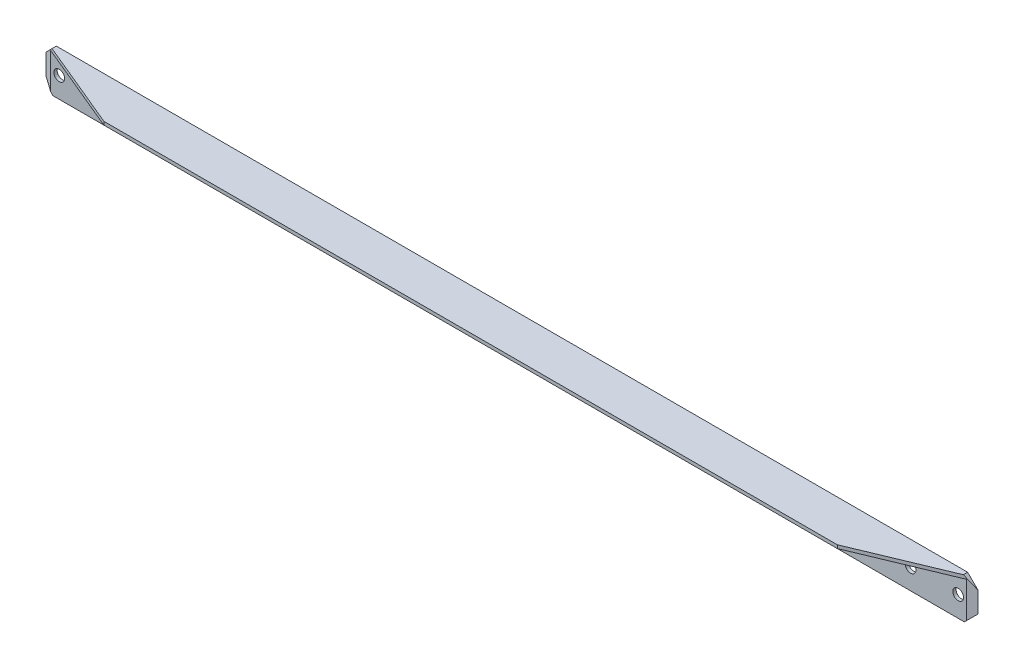
ISO-10303-21;
HEADER;
FILE_DESCRIPTION(('STEP AP214'),'2;1');
FILE_NAME('part.step','',(''),(''),'','','');
FILE_SCHEMA(('AUTOMOTIVE_DESIGN { 1 0 10303 214 1 1 1 1 }'));
ENDSEC;
DATA;
#1=APPLICATION_CONTEXT('core data for automotive mechanical design processes');
#2=APPLICATION_PROTOCOL_DEFINITION('international standard','automotive_design',2000,#1);
#3=PRODUCT_CONTEXT('',#1,'mechanical');
#4=PRODUCT('Part','Part','',(#3));
#5=PRODUCT_RELATED_PRODUCT_CATEGORY('part','',(#4));
#6=PRODUCT_DEFINITION_FORMATION('','',#4);
#7=PRODUCT_DEFINITION_CONTEXT('part definition',#1,'design');
#8=PRODUCT_DEFINITION('design','',#6,#7);
#9=PRODUCT_DEFINITION_SHAPE('','',#8);
#10=(LENGTH_UNIT() NAMED_UNIT(*) SI_UNIT(.MILLI.,.METRE.));
#11=(NAMED_UNIT(*) PLANE_ANGLE_UNIT() SI_UNIT($,.RADIAN.));
#12=(NAMED_UNIT(*) SI_UNIT($,.STERADIAN.) SOLID_ANGLE_UNIT());
#13=UNCERTAINTY_MEASURE_WITH_UNIT(LENGTH_MEASURE(1.E-05),#10,'distance_accuracy_value','');
#14=(GEOMETRIC_REPRESENTATION_CONTEXT(3) GLOBAL_UNCERTAINTY_ASSIGNED_CONTEXT((#13)) GLOBAL_UNIT_ASSIGNED_CONTEXT((#10,
#11,#12)) REPRESENTATION_CONTEXT('',''));
#15=CARTESIAN_POINT('',(0.,0.,0.));
#16=DIRECTION('',(0.,0.,1.));
#17=DIRECTION('',(1.,0.,0.));
#18=AXIS2_PLACEMENT_3D('',#15,#16,#17);
#19=CARTESIAN_POINT('',(-1126.,99.9999999999921,8.));
#20=DIRECTION('',(0.,0.,1.));
#21=DIRECTION('',(1.,0.,0.));
#22=AXIS2_PLACEMENT_3D('',#19,#20,#21);
#23=PLANE('',#22);
#24=CARTESIAN_POINT('',(-1086.,49.9999999999924,8.));
#25=DIRECTION('',(0.,0.,1.));
#26=DIRECTION('',(-1.,0.,0.));
#27=AXIS2_PLACEMENT_3D('',#24,#25,#26);
#28=CIRCLE('',#27,12.9999999999998);
#29=CARTESIAN_POINT('',(-1099.,49.9999999999924,8.));
#30=VERTEX_POINT('',#29);
#31=EDGE_CURVE('E139',#30,#30,#28,.T.);
#32=ORIENTED_EDGE('',*,*,#31,.F.);
#33=EDGE_LOOP('',(#32));
#34=FACE_BOUND('',#33,.T.);
#35=CARTESIAN_POINT('',(-160.,49.9999999999988,8.));
#36=DIRECTION('',(0.,0.,1.));
#37=DIRECTION('',(-1.,0.,0.));
#38=AXIS2_PLACEMENT_3D('',#35,#36,#37);
#39=CIRCLE('',#38,13.);
#40=CARTESIAN_POINT('',(-173.,49.9999999999988,8.));
#41=VERTEX_POINT('',#40);
#42=EDGE_CURVE('E154',#41,#41,#39,.T.);
#43=ORIENTED_EDGE('',*,*,#42,.F.);
#44=EDGE_LOOP('',(#43));
#45=FACE_BOUND('',#44,.T.);
#46=CARTESIAN_POINT('',(160.,49.9999999999999,8.));
#47=DIRECTION('',(0.,0.,1.));
#48=DIRECTION('',(1.,0.,0.));
#49=AXIS2_PLACEMENT_3D('',#46,#47,#48);
#50=CIRCLE('',#49,13.);
#51=CARTESIAN_POINT('',(173.,49.9999999999999,8.));
#52=VERTEX_POINT('',#51);
#53=EDGE_CURVE('E166',#52,#52,#50,.T.);
#54=ORIENTED_EDGE('',*,*,#53,.F.);
#55=EDGE_LOOP('',(#54));
#56=FACE_BOUND('',#55,.T.);
#57=CARTESIAN_POINT('',(0.,49.9999999999998,8.));
#58=DIRECTION('',(0.,0.,1.));
#59=DIRECTION('',(1.,0.,0.));
#60=AXIS2_PLACEMENT_3D('',#57,#58,#59);
#61=CIRCLE('',#60,13.);
#62=CARTESIAN_POINT('',(13.0000000000001,49.9999999999998,8.));
#63=VERTEX_POINT('',#62);
#64=EDGE_CURVE('E178',#63,#63,#61,.T.);
#65=ORIENTED_EDGE('',*,*,#64,.F.);
#66=EDGE_LOOP('',(#65));
#67=FACE_BOUND('',#66,.T.);
#68=CARTESIAN_POINT('',(1086.,50.,8.));
#69=DIRECTION('',(0.,0.,1.));
#70=DIRECTION('',(1.,0.,0.));
#71=AXIS2_PLACEMENT_3D('',#68,#69,#70);
#72=CIRCLE('',#71,12.9999999999998);
#73=CARTESIAN_POINT('',(1099.,50.,8.));
#74=VERTEX_POINT('',#73);
#75=EDGE_CURVE('E190',#74,#74,#72,.T.);
#76=ORIENTED_EDGE('',*,*,#75,.F.);
#77=EDGE_LOOP('',(#76));
#78=FACE_BOUND('',#77,.T.);
#79=CARTESIAN_POINT('',(971.,50.,8.));
#80=DIRECTION('',(0.,0.,1.));
#81=DIRECTION('',(1.,0.,0.));
#82=AXIS2_PLACEMENT_3D('',#79,#80,#81);
#83=CIRCLE('',#82,13.);
#84=CARTESIAN_POINT('',(984.,50.,8.));
#85=VERTEX_POINT('',#84);
#86=EDGE_CURVE('E184',#85,#85,#83,.T.);
#87=ORIENTED_EDGE('',*,*,#86,.F.);
#88=EDGE_LOOP('',(#87));
#89=FACE_BOUND('',#88,.T.);
#90=CARTESIAN_POINT('',(80.0000000000002,49.9999999999999,8.));
#91=DIRECTION('',(0.,0.,1.));
#92=DIRECTION('',(1.,0.,0.));
#93=AXIS2_PLACEMENT_3D('',#90,#91,#92);
#94=CIRCLE('',#93,13.);
#95=CARTESIAN_POINT('',(93.0000000000002,49.9999999999999,8.));
#96=VERTEX_POINT('',#95);
#97=EDGE_CURVE('E172',#96,#96,#94,.T.);
#98=ORIENTED_EDGE('',*,*,#97,.F.);
#99=EDGE_LOOP('',(#98));
#100=FACE_BOUND('',#99,.T.);
#101=CARTESIAN_POINT('',(-79.9999999999999,49.9999999999994,8.));
#102=DIRECTION('',(0.,0.,1.));
#103=DIRECTION('',(-1.,0.,0.));
#104=AXIS2_PLACEMENT_3D('',#101,#102,#103);
#105=CIRCLE('',#104,13.);
#106=CARTESIAN_POINT('',(-92.9999999999999,49.9999999999994,8.));
#107=VERTEX_POINT('',#106);
#108=EDGE_CURVE('E160',#107,#107,#105,.T.);
#109=ORIENTED_EDGE('',*,*,#108,.F.);
#110=EDGE_LOOP('',(#109));
#111=FACE_BOUND('',#110,.T.);
#112=CARTESIAN_POINT('',(-970.999999999999,49.9999999999932,8.));
#113=DIRECTION('',(0.,0.,1.));
#114=DIRECTION('',(-1.,0.,0.));
#115=AXIS2_PLACEMENT_3D('',#112,#113,#114);
#116=CIRCLE('',#115,13.0000000000002);
#117=CARTESIAN_POINT('',(-984.,49.9999999999932,8.));
#118=VERTEX_POINT('',#117);
#119=EDGE_CURVE('E148',#118,#118,#116,.T.);
#120=ORIENTED_EDGE('',*,*,#119,.F.);
#121=EDGE_LOOP('',(#120));
#122=FACE_BOUND('',#121,.T.);
#123=DIRECTION('',(1.,0.,0.));
#124=VECTOR('',#123,1.);
#125=CARTESIAN_POINT('',(-1126.,91.9999999999921,8.));
#126=LINE('',#125,#124);
#127=CARTESIAN_POINT('',(-1106.8,91.9999999999921,8.));
#128=VERTEX_POINT('',#127);
#129=CARTESIAN_POINT('',(1106.8,91.9999999999921,8.));
#130=VERTEX_POINT('',#129);
#131=EDGE_CURVE('E40',#128,#130,#126,.T.);
#132=ORIENTED_EDGE('',*,*,#131,.F.);
#133=DIRECTION('',(0.,-1.,0.));
#134=VECTOR('',#133,1.);
#135=CARTESIAN_POINT('',(-1106.8,99.9999999999921,8.));
#136=LINE('',#135,#134);
#137=CARTESIAN_POINT('',(-1106.8,5.79999999999307,8.));
#138=VERTEX_POINT('',#137);
#139=EDGE_CURVE('E235',#128,#138,#136,.T.);
#140=ORIENTED_EDGE('',*,*,#139,.T.);
#141=DIRECTION('',(-0.707106781186551,0.707106781186544,0.));
#142=VECTOR('',#141,1.);
#143=CARTESIAN_POINT('',(-1163.5,62.499999999992,8.));
#144=LINE('',#143,#142);
#145=CARTESIAN_POINT('',(-1101.,-7.78694259261069E-12,8.));
#146=VERTEX_POINT('',#145);
#147=EDGE_CURVE('E227',#138,#146,#144,.F.);
#148=ORIENTED_EDGE('',*,*,#147,.T.);
#149=DIRECTION('',(1.,0.,0.));
#150=VECTOR('',#149,1.);
#151=CARTESIAN_POINT('',(-1126.,-7.85482789922298E-12,8.));
#152=LINE('',#151,#150);
#153=CARTESIAN_POINT('',(1101.,-1.54621480411135E-13,8.));
#154=VERTEX_POINT('',#153);
#155=EDGE_CURVE('E196',#146,#154,#152,.T.);
#156=ORIENTED_EDGE('',*,*,#155,.T.);
#157=DIRECTION('',(-0.707106781186548,-0.707106781186548,0.));
#158=VECTOR('',#157,1.);
#159=CARTESIAN_POINT('',(37.4999999999959,-1063.5,8.));
#160=LINE('',#159,#158);
#161=CARTESIAN_POINT('',(1106.8,5.80000000000029,8.));
#162=VERTEX_POINT('',#161);
#163=EDGE_CURVE('E211',#154,#162,#160,.F.);
#164=ORIENTED_EDGE('',*,*,#163,.T.);
#165=DIRECTION('',(0.,-1.,0.));
#166=VECTOR('',#165,1.);
#167=CARTESIAN_POINT('',(1106.8,99.9999999999999,8.));
#168=LINE('',#167,#166);
#169=EDGE_CURVE('E254',#130,#162,#168,.T.);
#170=ORIENTED_EDGE('',*,*,#169,.F.);
#171=EDGE_LOOP('',(#132,#140,#148,#156,#164,#170));
#172=FACE_BOUND('',#171,.T.);
#173=ADVANCED_FACE('F36',(#34,#45,#56,#67,#78,#89,#100,#111,#122,#172),#23,.T.);
#174=CARTESIAN_POINT('',(1126.,100.,8.));
#175=DIRECTION('',(0.,-1.,0.));
#176=DIRECTION('',(1.,0.,0.));
#177=AXIS2_PLACEMENT_3D('',#174,#175,#176);
#178=PLANE('',#177);
#179=DIRECTION('',(0.923076923076923,0.,0.384615384615384));
#180=VECTOR('',#179,1.);
#181=CARTESIAN_POINT('',(-886.,99.9999999999992,100.));
#182=LINE('',#181,#180);
#183=CARTESIAN_POINT('',(-1101.,99.9999999999922,10.4166666666699));
#184=VERTEX_POINT('',#183);
#185=CARTESIAN_POINT('',(-886.,99.9999999999992,100.));
#186=VERTEX_POINT('',#185);
#187=EDGE_CURVE('E53',#184,#186,#182,.T.);
#188=ORIENTED_EDGE('',*,*,#187,.T.);
#189=DIRECTION('',(-1.,0.,0.));
#190=VECTOR('',#189,1.);
#191=CARTESIAN_POINT('',(-1126.,99.9999999999921,100.));
#192=LINE('',#191,#190);
#193=CARTESIAN_POINT('',(886.,99.9999999999992,100.));
#194=VERTEX_POINT('',#193);
#195=EDGE_CURVE('E128',#194,#186,#192,.T.);
#196=ORIENTED_EDGE('',*,*,#195,.F.);
#197=DIRECTION('',(-0.923076923076923,0.,0.384615384615384));
#198=VECTOR('',#197,1.);
#199=CARTESIAN_POINT('',(886.,99.9999999999992,100.));
#200=LINE('',#199,#198);
#201=CARTESIAN_POINT('',(1101.,99.9999999999999,10.4166666666666));
#202=VERTEX_POINT('',#201);
#203=EDGE_CURVE('E263',#202,#194,#200,.T.);
#204=ORIENTED_EDGE('',*,*,#203,.F.);
#205=DIRECTION('',(0.,0.,-1.));
#206=VECTOR('',#205,1.);
#207=CARTESIAN_POINT('',(1101.,99.9999999999999,8.));
#208=LINE('',#207,#206);
#209=CARTESIAN_POINT('',(1101.,99.9999999999999,0.));
#210=VERTEX_POINT('',#209);
#211=EDGE_CURVE('E214',#202,#210,#208,.T.);
#212=ORIENTED_EDGE('',*,*,#211,.T.);
#213=DIRECTION('',(-1.,0.,0.));
#214=VECTOR('',#213,1.);
#215=CARTESIAN_POINT('',(1126.,100.,0.));
#216=LINE('',#215,#214);
#217=CARTESIAN_POINT('',(-1101.,99.9999999999922,0.));
#218=VERTEX_POINT('',#217);
#219=EDGE_CURVE('E199',#210,#218,#216,.T.);
#220=ORIENTED_EDGE('',*,*,#219,.T.);
#221=DIRECTION('',(0.,0.,1.));
#222=VECTOR('',#221,1.);
#223=CARTESIAN_POINT('',(-1101.,99.9999999999922,8.));
#224=LINE('',#223,#222);
#225=EDGE_CURVE('E46',#218,#184,#224,.T.);
#226=ORIENTED_EDGE('',*,*,#225,.T.);
#227=EDGE_LOOP('',(#188,#196,#204,#212,#220,#226));
#228=FACE_BOUND('',#227,.T.);
#229=ADVANCED_FACE('F126',(#228),#178,.F.);
#230=CARTESIAN_POINT('',(-1126.,91.9999999999921,100.));
#231=DIRECTION('',(0.,1.,0.));
#232=DIRECTION('',(0.,0.,1.));
#233=AXIS2_PLACEMENT_3D('',#230,#231,#232);
#234=PLANE('',#233);
#235=DIRECTION('',(0.923076923076923,0.,0.384615384615384));
#236=VECTOR('',#235,1.);
#237=CARTESIAN_POINT('',(-1090.49704142012,91.9999999999921,14.792899408284));
#238=LINE('',#237,#236);
#239=CARTESIAN_POINT('',(-886.,91.9999999999921,100.));
#240=VERTEX_POINT('',#239);
#241=EDGE_CURVE('E117',#128,#240,#238,.T.);
#242=ORIENTED_EDGE('',*,*,#241,.F.);
#243=ORIENTED_EDGE('',*,*,#131,.T.);
#244=DIRECTION('',(-0.923076923076923,0.,0.384615384615384));
#245=VECTOR('',#244,1.);
#246=CARTESIAN_POINT('',(-828.366863905326,91.9999999999921,814.319526627218));
#247=LINE('',#246,#245);
#248=CARTESIAN_POINT('',(886.,91.9999999999921,100.));
#249=VERTEX_POINT('',#248);
#250=EDGE_CURVE('E257',#130,#249,#247,.T.);
#251=ORIENTED_EDGE('',*,*,#250,.T.);
#252=DIRECTION('',(1.,0.,0.));
#253=VECTOR('',#252,1.);
#254=CARTESIAN_POINT('',(-1126.,91.9999999999921,100.));
#255=LINE('',#254,#253);
#256=EDGE_CURVE('E136',#240,#249,#255,.T.);
#257=ORIENTED_EDGE('',*,*,#256,.F.);
#258=EDGE_LOOP('',(#242,#243,#251,#257));
#259=FACE_BOUND('',#258,.T.);
#260=ADVANCED_FACE('F275',(#259),#234,.F.);
#261=CARTESIAN_POINT('',(-1126.,91.9999999999921,100.));
#262=DIRECTION('',(0.,0.,1.));
#263=DIRECTION('',(1.,0.,0.));
#264=AXIS2_PLACEMENT_3D('',#261,#262,#263);
#265=PLANE('',#264);
#266=ORIENTED_EDGE('',*,*,#195,.T.);
#267=DIRECTION('',(0.,1.,0.));
#268=VECTOR('',#267,1.);
#269=CARTESIAN_POINT('',(-886.,-8.63198401646059E-12,100.));
#270=LINE('',#269,#268);
#271=EDGE_CURVE('E114',#240,#186,#270,.T.);
#272=ORIENTED_EDGE('',*,*,#271,.F.);
#273=ORIENTED_EDGE('',*,*,#256,.T.);
#274=DIRECTION('',(0.,1.,0.));
#275=VECTOR('',#274,1.);
#276=CARTESIAN_POINT('',(886.,-2.50000087020918E-05,100.));
#277=LINE('',#276,#275);
#278=EDGE_CURVE('E134',#249,#194,#277,.T.);
#279=ORIENTED_EDGE('',*,*,#278,.T.);
#280=EDGE_LOOP('',(#266,#272,#273,#279));
#281=FACE_BOUND('',#280,.T.);
#282=ADVANCED_FACE('F132',(#281),#265,.T.);
#283=CARTESIAN_POINT('',(-1101.,-7.76762954332575E-12,8.));
#284=DIRECTION('',(0.707106781186544,0.707106781186551,0.));
#285=DIRECTION('',(-0.707106781186551,0.707106781186544,0.));
#286=AXIS2_PLACEMENT_3D('',#283,#284,#285);
#287=PLANE('',#286);
#288=ORIENTED_EDGE('',*,*,#147,.F.);
#289=DIRECTION('',(0.678280102733068,-0.678280102733062,0.282616709472112));
#290=VECTOR('',#289,1.);
#291=CARTESIAN_POINT('',(-1101.46325878594,0.463258785934797,10.2236421725243));
#292=LINE('',#291,#290);
#293=CARTESIAN_POINT('',(-1126.,24.999999999993,0.));
#294=VERTEX_POINT('',#293);
#295=EDGE_CURVE('E121',#138,#294,#292,.F.);
#296=ORIENTED_EDGE('',*,*,#295,.T.);
#297=DIRECTION('',(0.707106781186551,-0.707106781186544,0.));
#298=VECTOR('',#297,1.);
#299=CARTESIAN_POINT('',(-1101.,-7.76762954332575E-12,0.));
#300=LINE('',#299,#298);
#301=CARTESIAN_POINT('',(-1101.,-7.76762954332575E-12,0.));
#302=VERTEX_POINT('',#301);
#303=EDGE_CURVE('E224',#302,#294,#300,.F.);
#304=ORIENTED_EDGE('',*,*,#303,.F.);
#305=DIRECTION('',(0.,0.,-1.));
#306=VECTOR('',#305,1.);
#307=CARTESIAN_POINT('',(-1101.,-7.76762954332575E-12,8.));
#308=LINE('',#307,#306);
#309=EDGE_CURVE('E221',#146,#302,#308,.T.);
#310=ORIENTED_EDGE('',*,*,#309,.F.);
#311=EDGE_LOOP('',(#288,#296,#304,#310));
#312=FACE_BOUND('',#311,.T.);
#313=ADVANCED_FACE('F244',(#312),#287,.F.);
#314=CARTESIAN_POINT('',(-1126.,74.9999999999919,8.));
#315=DIRECTION('',(0.707106781186556,-0.707106781186539,0.));
#316=DIRECTION('',(0.707106781186539,0.707106781186556,0.));
#317=AXIS2_PLACEMENT_3D('',#314,#315,#316);
#318=PLANE('',#317);
#319=DIRECTION('',(-0.707106781186539,-0.707106781186556,0.));
#320=VECTOR('',#319,1.);
#321=CARTESIAN_POINT('',(-1126.,74.9999999999919,0.));
#322=LINE('',#321,#320);
#323=CARTESIAN_POINT('',(-1126.,74.9999999999915,0.));
#324=VERTEX_POINT('',#323);
#325=EDGE_CURVE('E60',#324,#218,#322,.F.);
#326=ORIENTED_EDGE('',*,*,#325,.F.);
#327=DIRECTION('',(-0.678280102733059,-0.678280102733075,-0.282616709472106));
#328=VECTOR('',#327,1.);
#329=CARTESIAN_POINT('',(-1124.46645367412,76.5335463258705,0.638977635782847));
#330=LINE('',#329,#328);
#331=EDGE_CURVE('E11',#324,#184,#330,.F.);
#332=ORIENTED_EDGE('',*,*,#331,.T.);
#333=ORIENTED_EDGE('',*,*,#225,.F.);
#334=EDGE_LOOP('',(#326,#332,#333));
#335=FACE_BOUND('',#334,.T.);
#336=ADVANCED_FACE('F38',(#335),#318,.F.);
#337=CARTESIAN_POINT('',(-1126.,99.9999999999921,0.));
#338=DIRECTION('',(0.,0.,1.));
#339=DIRECTION('',(1.,0.,0.));
#340=AXIS2_PLACEMENT_3D('',#337,#338,#339);
#341=PLANE('',#340);
#342=CARTESIAN_POINT('',(-970.999999999999,49.9999999999932,0.));
#343=DIRECTION('',(0.,0.,1.));
#344=DIRECTION('',(-1.,0.,0.));
#345=AXIS2_PLACEMENT_3D('',#342,#343,#344);
#346=CIRCLE('',#345,13.0000000000002);
#347=CARTESIAN_POINT('',(-984.,49.9999999999932,0.));
#348=VERTEX_POINT('',#347);
#349=EDGE_CURVE('E146',#348,#348,#346,.T.);
#350=ORIENTED_EDGE('',*,*,#349,.T.);
#351=EDGE_LOOP('',(#350));
#352=FACE_BOUND('',#351,.T.);
#353=CARTESIAN_POINT('',(-79.9999999999999,49.9999999999994,0.));
#354=DIRECTION('',(0.,0.,1.));
#355=DIRECTION('',(-1.,0.,0.));
#356=AXIS2_PLACEMENT_3D('',#353,#354,#355);
#357=CIRCLE('',#356,13.);
#358=CARTESIAN_POINT('',(-92.9999999999999,49.9999999999994,0.));
#359=VERTEX_POINT('',#358);
#360=EDGE_CURVE('E157',#359,#359,#357,.T.);
#361=ORIENTED_EDGE('',*,*,#360,.T.);
#362=EDGE_LOOP('',(#361));
#363=FACE_BOUND('',#362,.T.);
#364=CARTESIAN_POINT('',(80.0000000000002,49.9999999999999,0.));
#365=DIRECTION('',(0.,0.,1.));
#366=DIRECTION('',(1.,0.,0.));
#367=AXIS2_PLACEMENT_3D('',#364,#365,#366);
#368=CIRCLE('',#367,13.);
#369=CARTESIAN_POINT('',(93.0000000000002,49.9999999999999,0.));
#370=VERTEX_POINT('',#369);
#371=EDGE_CURVE('E169',#370,#370,#368,.T.);
#372=ORIENTED_EDGE('',*,*,#371,.T.);
#373=EDGE_LOOP('',(#372));
#374=FACE_BOUND('',#373,.T.);
#375=CARTESIAN_POINT('',(971.,50.,0.));
#376=DIRECTION('',(0.,0.,1.));
#377=DIRECTION('',(1.,0.,0.));
#378=AXIS2_PLACEMENT_3D('',#375,#376,#377);
#379=CIRCLE('',#378,13.);
#380=CARTESIAN_POINT('',(984.,50.,0.));
#381=VERTEX_POINT('',#380);
#382=EDGE_CURVE('E181',#381,#381,#379,.T.);
#383=ORIENTED_EDGE('',*,*,#382,.T.);
#384=EDGE_LOOP('',(#383));
#385=FACE_BOUND('',#384,.T.);
#386=DIRECTION('',(0.,-1.,0.));
#387=VECTOR('',#386,1.);
#388=CARTESIAN_POINT('',(-1126.,-7.85482789922298E-12,0.));
#389=LINE('',#388,#387);
#390=EDGE_CURVE('E193',#324,#294,#389,.T.);
#391=ORIENTED_EDGE('',*,*,#390,.F.);
#392=ORIENTED_EDGE('',*,*,#325,.T.);
#393=ORIENTED_EDGE('',*,*,#219,.F.);
#394=DIRECTION('',(-0.707106781186546,0.707106781186549,0.));
#395=VECTOR('',#394,1.);
#396=CARTESIAN_POINT('',(1101.,99.9999999999999,0.));
#397=LINE('',#396,#395);
#398=CARTESIAN_POINT('',(1126.,74.9999999999999,0.));
#399=VERTEX_POINT('',#398);
#400=EDGE_CURVE('E216',#210,#399,#397,.F.);
#401=ORIENTED_EDGE('',*,*,#400,.T.);
#402=DIRECTION('',(0.,1.,0.));
#403=VECTOR('',#402,1.);
#404=CARTESIAN_POINT('',(1126.,0.,0.));
#405=LINE('',#404,#403);
#406=CARTESIAN_POINT('',(1126.,25.0000000000004,0.));
#407=VERTEX_POINT('',#406);
#408=EDGE_CURVE('E203',#407,#399,#405,.T.);
#409=ORIENTED_EDGE('',*,*,#408,.F.);
#410=DIRECTION('',(0.707106781186548,0.707106781186548,0.));
#411=VECTOR('',#410,1.);
#412=CARTESIAN_POINT('',(1126.,24.9999999999998,0.));
#413=LINE('',#412,#411);
#414=CARTESIAN_POINT('',(1101.,0.,0.));
#415=VERTEX_POINT('',#414);
#416=EDGE_CURVE('E198',#407,#415,#413,.F.);
#417=ORIENTED_EDGE('',*,*,#416,.T.);
#418=DIRECTION('',(1.,0.,0.));
#419=VECTOR('',#418,1.);
#420=CARTESIAN_POINT('',(-1126.,-7.85482789922298E-12,0.));
#421=LINE('',#420,#419);
#422=EDGE_CURVE('E201',#302,#415,#421,.T.);
#423=ORIENTED_EDGE('',*,*,#422,.F.);
#424=ORIENTED_EDGE('',*,*,#303,.T.);
#425=EDGE_LOOP('',(#391,#392,#393,#401,#409,#417,#423,#424));
#426=FACE_BOUND('',#425,.T.);
#427=CARTESIAN_POINT('',(1086.,50.,0.));
#428=DIRECTION('',(0.,0.,1.));
#429=DIRECTION('',(1.,0.,0.));
#430=AXIS2_PLACEMENT_3D('',#427,#428,#429);
#431=CIRCLE('',#430,12.9999999999998);
#432=CARTESIAN_POINT('',(1099.,50.,0.));
#433=VERTEX_POINT('',#432);
#434=EDGE_CURVE('E187',#433,#433,#431,.T.);
#435=ORIENTED_EDGE('',*,*,#434,.T.);
#436=EDGE_LOOP('',(#435));
#437=FACE_BOUND('',#436,.T.);
#438=CARTESIAN_POINT('',(0.,49.9999999999998,0.));
#439=DIRECTION('',(0.,0.,1.));
#440=DIRECTION('',(1.,0.,0.));
#441=AXIS2_PLACEMENT_3D('',#438,#439,#440);
#442=CIRCLE('',#441,13.);
#443=CARTESIAN_POINT('',(13.0000000000001,49.9999999999998,0.));
#444=VERTEX_POINT('',#443);
#445=EDGE_CURVE('E175',#444,#444,#442,.T.);
#446=ORIENTED_EDGE('',*,*,#445,.T.);
#447=EDGE_LOOP('',(#446));
#448=FACE_BOUND('',#447,.T.);
#449=CARTESIAN_POINT('',(160.,49.9999999999999,0.));
#450=DIRECTION('',(0.,0.,1.));
#451=DIRECTION('',(1.,0.,0.));
#452=AXIS2_PLACEMENT_3D('',#449,#450,#451);
#453=CIRCLE('',#452,13.);
#454=CARTESIAN_POINT('',(173.,49.9999999999999,0.));
#455=VERTEX_POINT('',#454);
#456=EDGE_CURVE('E163',#455,#455,#453,.T.);
#457=ORIENTED_EDGE('',*,*,#456,.T.);
#458=EDGE_LOOP('',(#457));
#459=FACE_BOUND('',#458,.T.);
#460=CARTESIAN_POINT('',(-160.,49.9999999999988,0.));
#461=DIRECTION('',(0.,0.,1.));
#462=DIRECTION('',(-1.,0.,0.));
#463=AXIS2_PLACEMENT_3D('',#460,#461,#462);
#464=CIRCLE('',#463,13.);
#465=CARTESIAN_POINT('',(-173.,49.9999999999988,0.));
#466=VERTEX_POINT('',#465);
#467=EDGE_CURVE('E151',#466,#466,#464,.T.);
#468=ORIENTED_EDGE('',*,*,#467,.T.);
#469=EDGE_LOOP('',(#468));
#470=FACE_BOUND('',#469,.T.);
#471=CARTESIAN_POINT('',(-1086.,49.9999999999924,0.));
#472=DIRECTION('',(0.,0.,1.));
#473=DIRECTION('',(-1.,0.,0.));
#474=AXIS2_PLACEMENT_3D('',#471,#472,#473);
#475=CIRCLE('',#474,12.9999999999998);
#476=CARTESIAN_POINT('',(-1099.,49.9999999999924,0.));
#477=VERTEX_POINT('',#476);
#478=EDGE_CURVE('E135',#477,#477,#475,.T.);
#479=ORIENTED_EDGE('',*,*,#478,.T.);
#480=EDGE_LOOP('',(#479));
#481=FACE_BOUND('',#480,.T.);
#482=ADVANCED_FACE('F245',(#352,#363,#374,#385,#426,#437,#448,#459,#470,#481),#341,.F.);
#483=CARTESIAN_POINT('',(-1126.,-7.85482789922298E-12,8.));
#484=DIRECTION('',(0.,1.,0.));
#485=DIRECTION('',(-1.,0.,0.));
#486=AXIS2_PLACEMENT_3D('',#483,#484,#485);
#487=PLANE('',#486);
#488=ORIENTED_EDGE('',*,*,#155,.F.);
#489=ORIENTED_EDGE('',*,*,#309,.T.);
#490=ORIENTED_EDGE('',*,*,#422,.T.);
#491=DIRECTION('',(0.,0.,1.));
#492=VECTOR('',#491,1.);
#493=CARTESIAN_POINT('',(1101.,0.,8.));
#494=LINE('',#493,#492);
#495=EDGE_CURVE('E208',#415,#154,#494,.T.);
#496=ORIENTED_EDGE('',*,*,#495,.T.);
#497=EDGE_LOOP('',(#488,#489,#490,#496));
#498=FACE_BOUND('',#497,.T.);
#499=ADVANCED_FACE('F240',(#498),#487,.F.);
#500=CARTESIAN_POINT('',(1086.,50.,8.));
#501=DIRECTION('',(0.,0.,-1.));
#502=DIRECTION('',(-1.,0.,0.));
#503=AXIS2_PLACEMENT_3D('',#500,#501,#502);
#504=CYLINDRICAL_SURFACE('',#503,12.9999999999998);
#505=ORIENTED_EDGE('',*,*,#75,.T.);
#506=EDGE_LOOP('',(#505));
#507=FACE_BOUND('',#506,.T.);
#508=ORIENTED_EDGE('',*,*,#434,.F.);
#509=EDGE_LOOP('',(#508));
#510=FACE_BOUND('',#509,.T.);
#511=ADVANCED_FACE('F294',(#507,#510),#504,.F.);
#512=CARTESIAN_POINT('',(971.,50.,8.));
#513=DIRECTION('',(0.,0.,-1.));
#514=DIRECTION('',(-1.,0.,0.));
#515=AXIS2_PLACEMENT_3D('',#512,#513,#514);
#516=CYLINDRICAL_SURFACE('',#515,13.);
#517=ORIENTED_EDGE('',*,*,#86,.T.);
#518=EDGE_LOOP('',(#517));
#519=FACE_BOUND('',#518,.T.);
#520=ORIENTED_EDGE('',*,*,#382,.F.);
#521=EDGE_LOOP('',(#520));
#522=FACE_BOUND('',#521,.T.);
#523=ADVANCED_FACE('F327',(#519,#522),#516,.F.);
#524=CARTESIAN_POINT('',(0.,49.9999999999998,8.));
#525=DIRECTION('',(0.,0.,-1.));
#526=DIRECTION('',(-1.,0.,0.));
#527=AXIS2_PLACEMENT_3D('',#524,#525,#526);
#528=CYLINDRICAL_SURFACE('',#527,13.);
#529=ORIENTED_EDGE('',*,*,#64,.T.);
#530=EDGE_LOOP('',(#529));
#531=FACE_BOUND('',#530,.T.);
#532=ORIENTED_EDGE('',*,*,#445,.F.);
#533=EDGE_LOOP('',(#532));
#534=FACE_BOUND('',#533,.T.);
#535=ADVANCED_FACE('F334',(#531,#534),#528,.F.);
#536=CARTESIAN_POINT('',(80.0000000000002,49.9999999999999,8.));
#537=DIRECTION('',(0.,0.,-1.));
#538=DIRECTION('',(-1.,0.,0.));
#539=AXIS2_PLACEMENT_3D('',#536,#537,#538);
#540=CYLINDRICAL_SURFACE('',#539,13.);
#541=ORIENTED_EDGE('',*,*,#97,.T.);
#542=EDGE_LOOP('',(#541));
#543=FACE_BOUND('',#542,.T.);
#544=ORIENTED_EDGE('',*,*,#371,.F.);
#545=EDGE_LOOP('',(#544));
#546=FACE_BOUND('',#545,.T.);
#547=ADVANCED_FACE('F341',(#543,#546),#540,.F.);
#548=CARTESIAN_POINT('',(160.,49.9999999999999,8.));
#549=DIRECTION('',(0.,0.,-1.));
#550=DIRECTION('',(-1.,0.,0.));
#551=AXIS2_PLACEMENT_3D('',#548,#549,#550);
#552=CYLINDRICAL_SURFACE('',#551,13.);
#553=ORIENTED_EDGE('',*,*,#53,.T.);
#554=EDGE_LOOP('',(#553));
#555=FACE_BOUND('',#554,.T.);
#556=ORIENTED_EDGE('',*,*,#456,.F.);
#557=EDGE_LOOP('',(#556));
#558=FACE_BOUND('',#557,.T.);
#559=ADVANCED_FACE('F349',(#555,#558),#552,.F.);
#560=CARTESIAN_POINT('',(-79.9999999999999,49.9999999999994,8.));
#561=DIRECTION('',(0.,0.,-1.));
#562=DIRECTION('',(-1.,0.,0.));
#563=AXIS2_PLACEMENT_3D('',#560,#561,#562);
#564=CYLINDRICAL_SURFACE('',#563,13.);
#565=ORIENTED_EDGE('',*,*,#108,.T.);
#566=EDGE_LOOP('',(#565));
#567=FACE_BOUND('',#566,.T.);
#568=ORIENTED_EDGE('',*,*,#360,.F.);
#569=EDGE_LOOP('',(#568));
#570=FACE_BOUND('',#569,.T.);
#571=ADVANCED_FACE('F357',(#567,#570),#564,.F.);
#572=CARTESIAN_POINT('',(-160.,49.9999999999988,8.));
#573=DIRECTION('',(0.,0.,-1.));
#574=DIRECTION('',(-1.,0.,0.));
#575=AXIS2_PLACEMENT_3D('',#572,#573,#574);
#576=CYLINDRICAL_SURFACE('',#575,13.);
#577=ORIENTED_EDGE('',*,*,#42,.T.);
#578=EDGE_LOOP('',(#577));
#579=FACE_BOUND('',#578,.T.);
#580=ORIENTED_EDGE('',*,*,#467,.F.);
#581=EDGE_LOOP('',(#580));
#582=FACE_BOUND('',#581,.T.);
#583=ADVANCED_FACE('F365',(#579,#582),#576,.F.);
#584=CARTESIAN_POINT('',(-970.999999999999,49.9999999999932,8.));
#585=DIRECTION('',(0.,0.,-1.));
#586=DIRECTION('',(-1.,0.,0.));
#587=AXIS2_PLACEMENT_3D('',#584,#585,#586);
#588=CYLINDRICAL_SURFACE('',#587,13.0000000000002);
#589=ORIENTED_EDGE('',*,*,#119,.T.);
#590=EDGE_LOOP('',(#589));
#591=FACE_BOUND('',#590,.T.);
#592=ORIENTED_EDGE('',*,*,#349,.F.);
#593=EDGE_LOOP('',(#592));
#594=FACE_BOUND('',#593,.T.);
#595=ADVANCED_FACE('F373',(#591,#594),#588,.F.);
#596=CARTESIAN_POINT('',(-1086.,49.9999999999924,8.));
#597=DIRECTION('',(0.,0.,-1.));
#598=DIRECTION('',(-1.,0.,0.));
#599=AXIS2_PLACEMENT_3D('',#596,#597,#598);
#600=CYLINDRICAL_SURFACE('',#599,12.9999999999998);
#601=ORIENTED_EDGE('',*,*,#31,.T.);
#602=EDGE_LOOP('',(#601));
#603=FACE_BOUND('',#602,.T.);
#604=ORIENTED_EDGE('',*,*,#478,.F.);
#605=EDGE_LOOP('',(#604));
#606=FACE_BOUND('',#605,.T.);
#607=ADVANCED_FACE('F303',(#603,#606),#600,.F.);
#608=CARTESIAN_POINT('',(1126.,24.9999999999998,8.));
#609=DIRECTION('',(-0.707106781186548,0.707106781186548,0.));
#610=DIRECTION('',(-0.707106781186548,-0.707106781186548,0.));
#611=AXIS2_PLACEMENT_3D('',#608,#609,#610);
#612=PLANE('',#611);
#613=DIRECTION('',(-0.678280102733066,-0.678280102733066,0.282616709472111));
#614=VECTOR('',#613,1.);
#615=CARTESIAN_POINT('',(1124.46645367412,23.4664536741213,0.638977635782912));
#616=LINE('',#615,#614);
#617=EDGE_CURVE('E252',#162,#407,#616,.F.);
#618=ORIENTED_EDGE('',*,*,#617,.F.);
#619=ORIENTED_EDGE('',*,*,#163,.F.);
#620=ORIENTED_EDGE('',*,*,#495,.F.);
#621=ORIENTED_EDGE('',*,*,#416,.F.);
#622=EDGE_LOOP('',(#618,#619,#620,#621));
#623=FACE_BOUND('',#622,.T.);
#624=ADVANCED_FACE('F251',(#623),#612,.F.);
#625=CARTESIAN_POINT('',(1101.,99.9999999999999,8.));
#626=DIRECTION('',(-0.707106781186549,-0.707106781186546,0.));
#627=DIRECTION('',(0.707106781186546,-0.707106781186549,0.));
#628=AXIS2_PLACEMENT_3D('',#625,#626,#627);
#629=PLANE('',#628);
#630=DIRECTION('',(0.678280102733064,-0.678280102733068,-0.282616709472109));
#631=VECTOR('',#630,1.);
#632=CARTESIAN_POINT('',(1101.46325878594,99.5367412140575,10.2236421725239));
#633=LINE('',#632,#631);
#634=EDGE_CURVE('E219',#399,#202,#633,.F.);
#635=ORIENTED_EDGE('',*,*,#634,.F.);
#636=ORIENTED_EDGE('',*,*,#400,.F.);
#637=ORIENTED_EDGE('',*,*,#211,.F.);
#638=EDGE_LOOP('',(#635,#636,#637));
#639=FACE_BOUND('',#638,.T.);
#640=ADVANCED_FACE('F272',(#639),#629,.F.);
#641=CARTESIAN_POINT('',(886.,-2.50000087020918E-05,100.));
#642=DIRECTION('',(-0.384615384615384,0.,-0.923076923076923));
#643=DIRECTION('',(-0.923076923076923,0.,0.384615384615384));
#644=AXIS2_PLACEMENT_3D('',#641,#642,#643);
#645=PLANE('',#644);
#646=ORIENTED_EDGE('',*,*,#169,.T.);
#647=ORIENTED_EDGE('',*,*,#617,.T.);
#648=ORIENTED_EDGE('',*,*,#408,.T.);
#649=ORIENTED_EDGE('',*,*,#634,.T.);
#650=ORIENTED_EDGE('',*,*,#203,.T.);
#651=ORIENTED_EDGE('',*,*,#278,.F.);
#652=ORIENTED_EDGE('',*,*,#250,.F.);
#653=EDGE_LOOP('',(#646,#647,#648,#649,#650,#651,#652));
#654=FACE_BOUND('',#653,.T.);
#655=ADVANCED_FACE('F267',(#654),#645,.F.);
#656=CARTESIAN_POINT('',(-886.,-8.63198401646059E-12,100.));
#657=DIRECTION('',(-0.384615384615384,0.,0.923076923076923));
#658=DIRECTION('',(0.923076923076923,0.,0.384615384615384));
#659=AXIS2_PLACEMENT_3D('',#656,#657,#658);
#660=PLANE('',#659);
#661=ORIENTED_EDGE('',*,*,#241,.T.);
#662=ORIENTED_EDGE('',*,*,#271,.T.);
#663=ORIENTED_EDGE('',*,*,#187,.F.);
#664=ORIENTED_EDGE('',*,*,#331,.F.);
#665=ORIENTED_EDGE('',*,*,#390,.T.);
#666=ORIENTED_EDGE('',*,*,#295,.F.);
#667=ORIENTED_EDGE('',*,*,#139,.F.);
#668=EDGE_LOOP('',(#661,#662,#663,#664,#665,#666,#667));
#669=FACE_BOUND('',#668,.T.);
#670=ADVANCED_FACE('F115',(#669),#660,.T.);
#671=CLOSED_SHELL('',(#173,#229,#260,#282,#313,#336,#482,#499,#511,#523,#535,#547,#559,#571,
#583,#595,#607,#624,#640,#655,#670));
#672=MANIFOLD_SOLID_BREP('B2',#671);
#673=ADVANCED_BREP_SHAPE_REPRESENTATION('',(#18,#672),#14);
#674=SHAPE_DEFINITION_REPRESENTATION(#9,#673);
ENDSEC;
END-ISO-10303-21;
